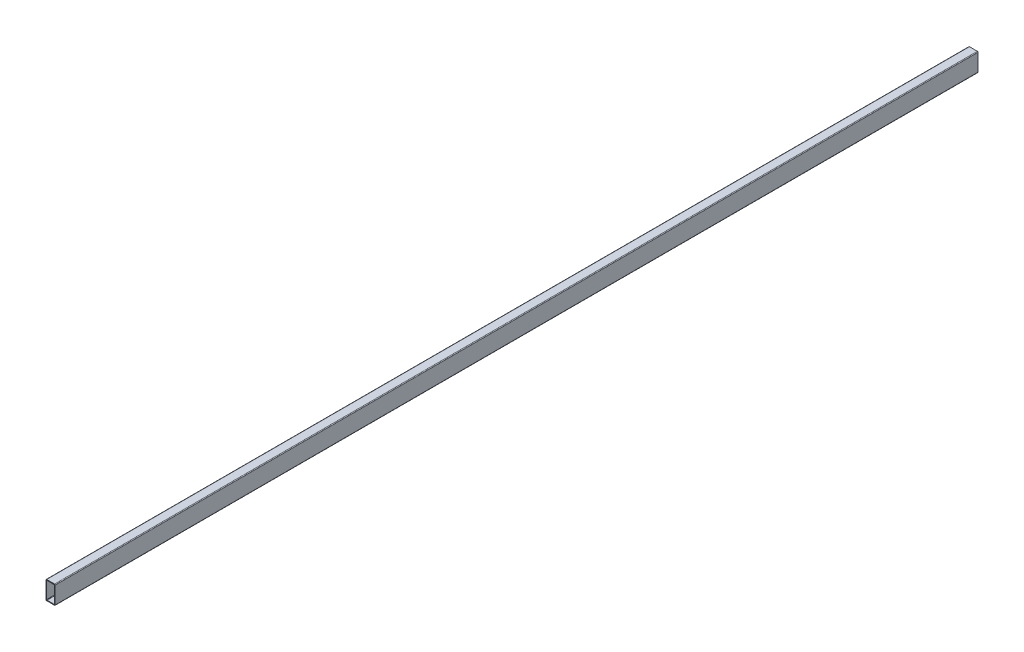
ISO-10303-21;
HEADER;
FILE_DESCRIPTION(('STEP AP214'),'2;1');
FILE_NAME('part.step','',(''),(''),'','','');
FILE_SCHEMA(('AUTOMOTIVE_DESIGN { 1 0 10303 214 1 1 1 1 }'));
ENDSEC;
DATA;
#1=APPLICATION_CONTEXT('core data for automotive mechanical design processes');
#2=APPLICATION_PROTOCOL_DEFINITION('international standard','automotive_design',2000,#1);
#3=PRODUCT_CONTEXT('',#1,'mechanical');
#4=PRODUCT('Part','Part','',(#3));
#5=PRODUCT_RELATED_PRODUCT_CATEGORY('part','',(#4));
#6=PRODUCT_DEFINITION_FORMATION('','',#4);
#7=PRODUCT_DEFINITION_CONTEXT('part definition',#1,'design');
#8=PRODUCT_DEFINITION('design','',#6,#7);
#9=PRODUCT_DEFINITION_SHAPE('','',#8);
#10=(LENGTH_UNIT() NAMED_UNIT(*) SI_UNIT(.MILLI.,.METRE.));
#11=(NAMED_UNIT(*) PLANE_ANGLE_UNIT() SI_UNIT($,.RADIAN.));
#12=(NAMED_UNIT(*) SI_UNIT($,.STERADIAN.) SOLID_ANGLE_UNIT());
#13=UNCERTAINTY_MEASURE_WITH_UNIT(LENGTH_MEASURE(1.E-05),#10,'distance_accuracy_value','');
#14=(GEOMETRIC_REPRESENTATION_CONTEXT(3) GLOBAL_UNCERTAINTY_ASSIGNED_CONTEXT((#13)) GLOBAL_UNIT_ASSIGNED_CONTEXT((#10,
#11,#12)) REPRESENTATION_CONTEXT('',''));
#15=CARTESIAN_POINT('',(0.,0.,0.));
#16=DIRECTION('',(0.,0.,1.));
#17=DIRECTION('',(1.,0.,0.));
#18=AXIS2_PLACEMENT_3D('',#15,#16,#17);
#19=CARTESIAN_POINT('',(18.5,38.4999999999994,1000.));
#20=DIRECTION('',(0.,0.,-1.));
#21=DIRECTION('',(-1.,0.,0.));
#22=AXIS2_PLACEMENT_3D('',#19,#20,#21);
#23=PLANE('',#22);
#24=CARTESIAN_POINT('',(18.5,38.4999999999994,1000.));
#25=DIRECTION('',(0.,0.,1.));
#26=DIRECTION('',(-1.,0.,0.));
#27=AXIS2_PLACEMENT_3D('',#24,#25,#26);
#28=CIRCLE('',#27,1.5);
#29=CARTESIAN_POINT('',(20.,38.4999999999994,1000.));
#30=VERTEX_POINT('',#29);
#31=CARTESIAN_POINT('',(18.5,39.9999999999994,1000.));
#32=VERTEX_POINT('',#31);
#33=EDGE_CURVE('E238',#30,#32,#28,.T.);
#34=ORIENTED_EDGE('',*,*,#33,.T.);
#35=DIRECTION('',(-1.,0.,0.));
#36=VECTOR('',#35,1.);
#37=CARTESIAN_POINT('',(1.5,39.9999999999994,1000.));
#38=LINE('',#37,#36);
#39=CARTESIAN_POINT('',(1.5,39.9999999999994,1000.));
#40=VERTEX_POINT('',#39);
#41=EDGE_CURVE('E240',#32,#40,#38,.T.);
#42=ORIENTED_EDGE('',*,*,#41,.T.);
#43=CARTESIAN_POINT('',(1.5,38.4999999999994,1000.));
#44=DIRECTION('',(0.,0.,1.));
#45=DIRECTION('',(-1.,0.,0.));
#46=AXIS2_PLACEMENT_3D('',#43,#44,#45);
#47=CIRCLE('',#46,1.50000000000001);
#48=CARTESIAN_POINT('',(0.,38.4999999999994,1000.));
#49=VERTEX_POINT('',#48);
#50=EDGE_CURVE('E242',#40,#49,#47,.T.);
#51=ORIENTED_EDGE('',*,*,#50,.T.);
#52=DIRECTION('',(0.,-1.,0.));
#53=VECTOR('',#52,1.);
#54=CARTESIAN_POINT('',(0.,38.4999999999994,1000.));
#55=LINE('',#54,#53);
#56=CARTESIAN_POINT('',(0.,1.4999999999994,1000.));
#57=VERTEX_POINT('',#56);
#58=EDGE_CURVE('E244',#49,#57,#55,.T.);
#59=ORIENTED_EDGE('',*,*,#58,.T.);
#60=CARTESIAN_POINT('',(1.5,1.4999999999994,1000.));
#61=DIRECTION('',(0.,0.,1.));
#62=DIRECTION('',(1.,0.,0.));
#63=AXIS2_PLACEMENT_3D('',#60,#61,#62);
#64=CIRCLE('',#63,1.50000000000001);
#65=CARTESIAN_POINT('',(1.5,-6.03683769639929E-13,1000.));
#66=VERTEX_POINT('',#65);
#67=EDGE_CURVE('E246',#57,#66,#64,.T.);
#68=ORIENTED_EDGE('',*,*,#67,.T.);
#69=DIRECTION('',(1.,0.,0.));
#70=VECTOR('',#69,1.);
#71=CARTESIAN_POINT('',(1.5,-6.10622663543836E-13,1000.));
#72=LINE('',#71,#70);
#73=CARTESIAN_POINT('',(18.5,-6.10622663543836E-13,1000.));
#74=VERTEX_POINT('',#73);
#75=EDGE_CURVE('E248',#66,#74,#72,.T.);
#76=ORIENTED_EDGE('',*,*,#75,.T.);
#77=CARTESIAN_POINT('',(18.5,1.4999999999994,1000.));
#78=DIRECTION('',(0.,0.,1.));
#79=DIRECTION('',(-1.,0.,0.));
#80=AXIS2_PLACEMENT_3D('',#77,#78,#79);
#81=CIRCLE('',#80,1.50000000000001);
#82=CARTESIAN_POINT('',(20.,1.4999999999994,1000.));
#83=VERTEX_POINT('',#82);
#84=EDGE_CURVE('E250',#74,#83,#81,.T.);
#85=ORIENTED_EDGE('',*,*,#84,.T.);
#86=DIRECTION('',(0.,1.,0.));
#87=VECTOR('',#86,1.);
#88=CARTESIAN_POINT('',(20.,38.4999999999994,1000.));
#89=LINE('',#88,#87);
#90=EDGE_CURVE('E58',#83,#30,#89,.T.);
#91=ORIENTED_EDGE('',*,*,#90,.T.);
#92=EDGE_LOOP('',(#34,#42,#51,#59,#68,#76,#85,#91));
#93=FACE_BOUND('',#92,.T.);
#94=CARTESIAN_POINT('',(17.5,2.49999999999941,1000.));
#95=DIRECTION('',(0.,0.,1.));
#96=DIRECTION('',(-1.,0.,0.));
#97=AXIS2_PLACEMENT_3D('',#94,#95,#96);
#98=CIRCLE('',#97,0.999999999999994);
#99=CARTESIAN_POINT('',(17.5,1.49999999999942,1000.));
#100=VERTEX_POINT('',#99);
#101=CARTESIAN_POINT('',(18.5,2.49999999999941,1000.));
#102=VERTEX_POINT('',#101);
#103=EDGE_CURVE('E211',#100,#102,#98,.T.);
#104=ORIENTED_EDGE('',*,*,#103,.F.);
#105=DIRECTION('',(1.,0.,0.));
#106=VECTOR('',#105,1.);
#107=CARTESIAN_POINT('',(2.50000000000001,1.4999999999994,1000.));
#108=LINE('',#107,#106);
#109=CARTESIAN_POINT('',(2.50000000000001,1.4999999999994,1000.));
#110=VERTEX_POINT('',#109);
#111=EDGE_CURVE('E153',#110,#100,#108,.T.);
#112=ORIENTED_EDGE('',*,*,#111,.F.);
#113=CARTESIAN_POINT('',(2.50000000000001,2.49999999999941,1000.));
#114=DIRECTION('',(0.,0.,1.));
#115=DIRECTION('',(1.,0.,0.));
#116=AXIS2_PLACEMENT_3D('',#113,#114,#115);
#117=CIRCLE('',#116,0.999999999999999);
#118=CARTESIAN_POINT('',(1.50000000000001,2.49999999999941,1000.));
#119=VERTEX_POINT('',#118);
#120=EDGE_CURVE('E223',#119,#110,#117,.T.);
#121=ORIENTED_EDGE('',*,*,#120,.F.);
#122=DIRECTION('',(0.,-1.,0.));
#123=VECTOR('',#122,1.);
#124=CARTESIAN_POINT('',(1.5,37.4999999999994,1000.));
#125=LINE('',#124,#123);
#126=CARTESIAN_POINT('',(1.50000000000001,37.4999999999994,1000.));
#127=VERTEX_POINT('',#126);
#128=EDGE_CURVE('E221',#127,#119,#125,.T.);
#129=ORIENTED_EDGE('',*,*,#128,.F.);
#130=CARTESIAN_POINT('',(2.50000000000001,37.4999999999994,1000.));
#131=DIRECTION('',(0.,0.,1.));
#132=DIRECTION('',(-1.,0.,0.));
#133=AXIS2_PLACEMENT_3D('',#130,#131,#132);
#134=CIRCLE('',#133,1.);
#135=CARTESIAN_POINT('',(2.50000000000001,38.4999999999994,1000.));
#136=VERTEX_POINT('',#135);
#137=EDGE_CURVE('E219',#136,#127,#134,.T.);
#138=ORIENTED_EDGE('',*,*,#137,.F.);
#139=DIRECTION('',(-1.,0.,0.));
#140=VECTOR('',#139,1.);
#141=CARTESIAN_POINT('',(2.50000000000001,38.4999999999994,1000.));
#142=LINE('',#141,#140);
#143=CARTESIAN_POINT('',(17.5,38.4999999999994,1000.));
#144=VERTEX_POINT('',#143);
#145=EDGE_CURVE('E217',#144,#136,#142,.T.);
#146=ORIENTED_EDGE('',*,*,#145,.F.);
#147=CARTESIAN_POINT('',(17.5,37.4999999999994,1000.));
#148=DIRECTION('',(0.,0.,1.));
#149=DIRECTION('',(-1.,0.,0.));
#150=AXIS2_PLACEMENT_3D('',#147,#148,#149);
#151=CIRCLE('',#150,1.);
#152=CARTESIAN_POINT('',(18.5,37.4999999999994,1000.));
#153=VERTEX_POINT('',#152);
#154=EDGE_CURVE('E215',#153,#144,#151,.T.);
#155=ORIENTED_EDGE('',*,*,#154,.F.);
#156=DIRECTION('',(0.,1.,0.));
#157=VECTOR('',#156,1.);
#158=CARTESIAN_POINT('',(18.5,37.4999999999994,1000.));
#159=LINE('',#158,#157);
#160=EDGE_CURVE('E213',#102,#153,#159,.T.);
#161=ORIENTED_EDGE('',*,*,#160,.F.);
#162=EDGE_LOOP('',(#104,#112,#121,#129,#138,#146,#155,#161));
#163=FACE_BOUND('',#162,.T.);
#164=ADVANCED_FACE('F35',(#93,#163),#23,.F.);
#165=CARTESIAN_POINT('',(18.5,38.4999999999994,1000.));
#166=DIRECTION('',(0.,0.,-1.));
#167=DIRECTION('',(-1.,0.,0.));
#168=AXIS2_PLACEMENT_3D('',#165,#166,#167);
#169=CYLINDRICAL_SURFACE('',#168,1.5);
#170=DIRECTION('',(0.,0.,-1.));
#171=VECTOR('',#170,1.);
#172=CARTESIAN_POINT('',(20.,38.4999999999994,1000.));
#173=LINE('',#172,#171);
#174=CARTESIAN_POINT('',(20.,38.4999999999994,-1000.));
#175=VERTEX_POINT('',#174);
#176=EDGE_CURVE('E253',#30,#175,#173,.T.);
#177=ORIENTED_EDGE('',*,*,#176,.T.);
#178=CARTESIAN_POINT('',(18.5,38.4999999999994,-1000.));
#179=DIRECTION('',(0.,0.,1.));
#180=DIRECTION('',(-1.,0.,0.));
#181=AXIS2_PLACEMENT_3D('',#178,#179,#180);
#182=CIRCLE('',#181,1.5);
#183=CARTESIAN_POINT('',(18.5,39.9999999999994,-1000.));
#184=VERTEX_POINT('',#183);
#185=EDGE_CURVE('E187',#175,#184,#182,.T.);
#186=ORIENTED_EDGE('',*,*,#185,.T.);
#187=DIRECTION('',(0.,0.,-1.));
#188=VECTOR('',#187,1.);
#189=CARTESIAN_POINT('',(18.5,39.9999999999994,1000.));
#190=LINE('',#189,#188);
#191=EDGE_CURVE('E11',#32,#184,#190,.T.);
#192=ORIENTED_EDGE('',*,*,#191,.F.);
#193=ORIENTED_EDGE('',*,*,#33,.F.);
#194=EDGE_LOOP('',(#177,#186,#192,#193));
#195=FACE_BOUND('',#194,.T.);
#196=ADVANCED_FACE('F37',(#195),#169,.T.);
#197=CARTESIAN_POINT('',(1.5,39.9999999999994,1000.));
#198=DIRECTION('',(0.,-1.,0.));
#199=DIRECTION('',(1.,0.,0.));
#200=AXIS2_PLACEMENT_3D('',#197,#198,#199);
#201=PLANE('',#200);
#202=ORIENTED_EDGE('',*,*,#191,.T.);
#203=DIRECTION('',(-1.,0.,0.));
#204=VECTOR('',#203,1.);
#205=CARTESIAN_POINT('',(1.5,39.9999999999994,-1000.));
#206=LINE('',#205,#204);
#207=CARTESIAN_POINT('',(1.5,39.9999999999994,-1000.));
#208=VERTEX_POINT('',#207);
#209=EDGE_CURVE('E208',#184,#208,#206,.T.);
#210=ORIENTED_EDGE('',*,*,#209,.T.);
#211=DIRECTION('',(0.,0.,-1.));
#212=VECTOR('',#211,1.);
#213=CARTESIAN_POINT('',(1.5,39.9999999999994,1000.));
#214=LINE('',#213,#212);
#215=EDGE_CURVE('E43',#40,#208,#214,.T.);
#216=ORIENTED_EDGE('',*,*,#215,.F.);
#217=ORIENTED_EDGE('',*,*,#41,.F.);
#218=EDGE_LOOP('',(#202,#210,#216,#217));
#219=FACE_BOUND('',#218,.T.);
#220=ADVANCED_FACE('F275',(#219),#201,.F.);
#221=CARTESIAN_POINT('',(1.5,38.4999999999994,1000.));
#222=DIRECTION('',(0.,0.,-1.));
#223=DIRECTION('',(-1.,0.,0.));
#224=AXIS2_PLACEMENT_3D('',#221,#222,#223);
#225=CYLINDRICAL_SURFACE('',#224,1.50000000000001);
#226=ORIENTED_EDGE('',*,*,#215,.T.);
#227=CARTESIAN_POINT('',(1.5,38.4999999999994,-1000.));
#228=DIRECTION('',(0.,0.,1.));
#229=DIRECTION('',(-1.,0.,0.));
#230=AXIS2_PLACEMENT_3D('',#227,#228,#229);
#231=CIRCLE('',#230,1.50000000000001);
#232=CARTESIAN_POINT('',(0.,38.4999999999994,-1000.));
#233=VERTEX_POINT('',#232);
#234=EDGE_CURVE('E205',#208,#233,#231,.T.);
#235=ORIENTED_EDGE('',*,*,#234,.T.);
#236=DIRECTION('',(0.,0.,-1.));
#237=VECTOR('',#236,1.);
#238=CARTESIAN_POINT('',(0.,38.4999999999994,1000.));
#239=LINE('',#238,#237);
#240=EDGE_CURVE('E263',#49,#233,#239,.T.);
#241=ORIENTED_EDGE('',*,*,#240,.F.);
#242=ORIENTED_EDGE('',*,*,#50,.F.);
#243=EDGE_LOOP('',(#226,#235,#241,#242));
#244=FACE_BOUND('',#243,.T.);
#245=ADVANCED_FACE('F268',(#244),#225,.T.);
#246=CARTESIAN_POINT('',(0.,38.4999999999994,1000.));
#247=DIRECTION('',(1.,0.,0.));
#248=DIRECTION('',(0.,1.,0.));
#249=AXIS2_PLACEMENT_3D('',#246,#247,#248);
#250=PLANE('',#249);
#251=ORIENTED_EDGE('',*,*,#240,.T.);
#252=DIRECTION('',(0.,-1.,0.));
#253=VECTOR('',#252,1.);
#254=CARTESIAN_POINT('',(0.,38.4999999999994,-1000.));
#255=LINE('',#254,#253);
#256=CARTESIAN_POINT('',(0.,1.4999999999994,-1000.));
#257=VERTEX_POINT('',#256);
#258=EDGE_CURVE('E202',#233,#257,#255,.T.);
#259=ORIENTED_EDGE('',*,*,#258,.T.);
#260=DIRECTION('',(0.,0.,-1.));
#261=VECTOR('',#260,1.);
#262=CARTESIAN_POINT('',(0.,1.4999999999994,1000.));
#263=LINE('',#262,#261);
#264=EDGE_CURVE('E261',#57,#257,#263,.T.);
#265=ORIENTED_EDGE('',*,*,#264,.F.);
#266=ORIENTED_EDGE('',*,*,#58,.F.);
#267=EDGE_LOOP('',(#251,#259,#265,#266));
#268=FACE_BOUND('',#267,.T.);
#269=ADVANCED_FACE('F298',(#268),#250,.F.);
#270=CARTESIAN_POINT('',(1.5,1.4999999999994,1000.));
#271=DIRECTION('',(0.,0.,-1.));
#272=DIRECTION('',(-1.,0.,0.));
#273=AXIS2_PLACEMENT_3D('',#270,#271,#272);
#274=CYLINDRICAL_SURFACE('',#273,1.50000000000001);
#275=ORIENTED_EDGE('',*,*,#264,.T.);
#276=CARTESIAN_POINT('',(1.5,1.4999999999994,-1000.));
#277=DIRECTION('',(0.,0.,1.));
#278=DIRECTION('',(1.,0.,0.));
#279=AXIS2_PLACEMENT_3D('',#276,#277,#278);
#280=CIRCLE('',#279,1.50000000000001);
#281=CARTESIAN_POINT('',(1.5,-6.03683769639929E-13,-1000.));
#282=VERTEX_POINT('',#281);
#283=EDGE_CURVE('E199',#257,#282,#280,.T.);
#284=ORIENTED_EDGE('',*,*,#283,.T.);
#285=DIRECTION('',(0.,0.,-1.));
#286=VECTOR('',#285,1.);
#287=CARTESIAN_POINT('',(1.5,-6.03683769639929E-13,1000.));
#288=LINE('',#287,#286);
#289=EDGE_CURVE('E259',#66,#282,#288,.T.);
#290=ORIENTED_EDGE('',*,*,#289,.F.);
#291=ORIENTED_EDGE('',*,*,#67,.F.);
#292=EDGE_LOOP('',(#275,#284,#290,#291));
#293=FACE_BOUND('',#292,.T.);
#294=ADVANCED_FACE('F295',(#293),#274,.T.);
#295=CARTESIAN_POINT('',(1.5,-6.10622663543836E-13,1000.));
#296=DIRECTION('',(0.,1.,0.));
#297=DIRECTION('',(0.,0.,1.));
#298=AXIS2_PLACEMENT_3D('',#295,#296,#297);
#299=PLANE('',#298);
#300=ORIENTED_EDGE('',*,*,#289,.T.);
#301=DIRECTION('',(1.,0.,0.));
#302=VECTOR('',#301,1.);
#303=CARTESIAN_POINT('',(1.5,-6.10622663543836E-13,-1000.));
#304=LINE('',#303,#302);
#305=CARTESIAN_POINT('',(18.5,-6.10622663543836E-13,-1000.));
#306=VERTEX_POINT('',#305);
#307=EDGE_CURVE('E196',#282,#306,#304,.T.);
#308=ORIENTED_EDGE('',*,*,#307,.T.);
#309=DIRECTION('',(0.,0.,-1.));
#310=VECTOR('',#309,1.);
#311=CARTESIAN_POINT('',(18.5,-6.10622663543836E-13,1000.));
#312=LINE('',#311,#310);
#313=EDGE_CURVE('E257',#74,#306,#312,.T.);
#314=ORIENTED_EDGE('',*,*,#313,.F.);
#315=ORIENTED_EDGE('',*,*,#75,.F.);
#316=EDGE_LOOP('',(#300,#308,#314,#315));
#317=FACE_BOUND('',#316,.T.);
#318=ADVANCED_FACE('F290',(#317),#299,.F.);
#319=CARTESIAN_POINT('',(18.5,1.4999999999994,1000.));
#320=DIRECTION('',(0.,0.,-1.));
#321=DIRECTION('',(-1.,0.,0.));
#322=AXIS2_PLACEMENT_3D('',#319,#320,#321);
#323=CYLINDRICAL_SURFACE('',#322,1.50000000000001);
#324=ORIENTED_EDGE('',*,*,#313,.T.);
#325=CARTESIAN_POINT('',(18.5,1.4999999999994,-1000.));
#326=DIRECTION('',(0.,0.,1.));
#327=DIRECTION('',(-1.,0.,0.));
#328=AXIS2_PLACEMENT_3D('',#325,#326,#327);
#329=CIRCLE('',#328,1.50000000000001);
#330=CARTESIAN_POINT('',(20.,1.4999999999994,-1000.));
#331=VERTEX_POINT('',#330);
#332=EDGE_CURVE('E193',#306,#331,#329,.T.);
#333=ORIENTED_EDGE('',*,*,#332,.T.);
#334=DIRECTION('',(0.,0.,-1.));
#335=VECTOR('',#334,1.);
#336=CARTESIAN_POINT('',(20.,1.4999999999994,1000.));
#337=LINE('',#336,#335);
#338=EDGE_CURVE('E255',#83,#331,#337,.T.);
#339=ORIENTED_EDGE('',*,*,#338,.F.);
#340=ORIENTED_EDGE('',*,*,#84,.F.);
#341=EDGE_LOOP('',(#324,#333,#339,#340));
#342=FACE_BOUND('',#341,.T.);
#343=ADVANCED_FACE('F286',(#342),#323,.T.);
#344=CARTESIAN_POINT('',(20.,38.4999999999994,1000.));
#345=DIRECTION('',(-1.,0.,0.));
#346=DIRECTION('',(0.,0.,1.));
#347=AXIS2_PLACEMENT_3D('',#344,#345,#346);
#348=PLANE('',#347);
#349=ORIENTED_EDGE('',*,*,#338,.T.);
#350=DIRECTION('',(0.,1.,0.));
#351=VECTOR('',#350,1.);
#352=CARTESIAN_POINT('',(20.,38.4999999999994,-1000.));
#353=LINE('',#352,#351);
#354=EDGE_CURVE('E190',#331,#175,#353,.T.);
#355=ORIENTED_EDGE('',*,*,#354,.T.);
#356=ORIENTED_EDGE('',*,*,#176,.F.);
#357=ORIENTED_EDGE('',*,*,#90,.F.);
#358=EDGE_LOOP('',(#349,#355,#356,#357));
#359=FACE_BOUND('',#358,.T.);
#360=ADVANCED_FACE('F282',(#359),#348,.F.);
#361=CARTESIAN_POINT('',(17.5,2.49999999999941,1000.));
#362=DIRECTION('',(0.,0.,-1.));
#363=DIRECTION('',(-1.,0.,0.));
#364=AXIS2_PLACEMENT_3D('',#361,#362,#363);
#365=CYLINDRICAL_SURFACE('',#364,0.999999999999994);
#366=DIRECTION('',(0.,0.,-1.));
#367=VECTOR('',#366,1.);
#368=CARTESIAN_POINT('',(18.5,2.49999999999941,1000.));
#369=LINE('',#368,#367);
#370=CARTESIAN_POINT('',(18.5,2.49999999999941,-1000.));
#371=VERTEX_POINT('',#370);
#372=EDGE_CURVE('E161',#102,#371,#369,.T.);
#373=ORIENTED_EDGE('',*,*,#372,.T.);
#374=CARTESIAN_POINT('',(17.5,2.49999999999941,-1000.));
#375=DIRECTION('',(0.,0.,1.));
#376=DIRECTION('',(-1.,0.,0.));
#377=AXIS2_PLACEMENT_3D('',#374,#375,#376);
#378=CIRCLE('',#377,0.999999999999994);
#379=CARTESIAN_POINT('',(17.5,1.49999999999942,-1000.));
#380=VERTEX_POINT('',#379);
#381=EDGE_CURVE('E158',#380,#371,#378,.T.);
#382=ORIENTED_EDGE('',*,*,#381,.F.);
#383=DIRECTION('',(0.,0.,-1.));
#384=VECTOR('',#383,1.);
#385=CARTESIAN_POINT('',(17.5,1.49999999999942,1000.));
#386=LINE('',#385,#384);
#387=EDGE_CURVE('E146',#100,#380,#386,.T.);
#388=ORIENTED_EDGE('',*,*,#387,.F.);
#389=ORIENTED_EDGE('',*,*,#103,.T.);
#390=EDGE_LOOP('',(#373,#382,#388,#389));
#391=FACE_BOUND('',#390,.T.);
#392=ADVANCED_FACE('F159',(#391),#365,.F.);
#393=CARTESIAN_POINT('',(18.5,37.4999999999994,1000.));
#394=DIRECTION('',(-1.,0.,0.));
#395=DIRECTION('',(0.,0.,1.));
#396=AXIS2_PLACEMENT_3D('',#393,#394,#395);
#397=PLANE('',#396);
#398=DIRECTION('',(0.,0.,-1.));
#399=VECTOR('',#398,1.);
#400=CARTESIAN_POINT('',(18.5,37.4999999999994,1000.));
#401=LINE('',#400,#399);
#402=CARTESIAN_POINT('',(18.5,37.4999999999994,-1000.));
#403=VERTEX_POINT('',#402);
#404=EDGE_CURVE('E235',#153,#403,#401,.T.);
#405=ORIENTED_EDGE('',*,*,#404,.T.);
#406=DIRECTION('',(0.,1.,0.));
#407=VECTOR('',#406,1.);
#408=CARTESIAN_POINT('',(18.5,37.4999999999994,-1000.));
#409=LINE('',#408,#407);
#410=EDGE_CURVE('E185',#371,#403,#409,.T.);
#411=ORIENTED_EDGE('',*,*,#410,.F.);
#412=ORIENTED_EDGE('',*,*,#372,.F.);
#413=ORIENTED_EDGE('',*,*,#160,.T.);
#414=EDGE_LOOP('',(#405,#411,#412,#413));
#415=FACE_BOUND('',#414,.T.);
#416=ADVANCED_FACE('F307',(#415),#397,.T.);
#417=CARTESIAN_POINT('',(17.5,37.4999999999994,1000.));
#418=DIRECTION('',(0.,0.,-1.));
#419=DIRECTION('',(-1.,0.,0.));
#420=AXIS2_PLACEMENT_3D('',#417,#418,#419);
#421=CYLINDRICAL_SURFACE('',#420,1.);
#422=DIRECTION('',(0.,0.,-1.));
#423=VECTOR('',#422,1.);
#424=CARTESIAN_POINT('',(17.5,38.4999999999994,1000.));
#425=LINE('',#424,#423);
#426=CARTESIAN_POINT('',(17.5,38.4999999999994,-1000.));
#427=VERTEX_POINT('',#426);
#428=EDGE_CURVE('E233',#144,#427,#425,.T.);
#429=ORIENTED_EDGE('',*,*,#428,.T.);
#430=CARTESIAN_POINT('',(17.5,37.4999999999994,-1000.));
#431=DIRECTION('',(0.,0.,1.));
#432=DIRECTION('',(-1.,0.,0.));
#433=AXIS2_PLACEMENT_3D('',#430,#431,#432);
#434=CIRCLE('',#433,1.);
#435=EDGE_CURVE('E182',#403,#427,#434,.T.);
#436=ORIENTED_EDGE('',*,*,#435,.F.);
#437=ORIENTED_EDGE('',*,*,#404,.F.);
#438=ORIENTED_EDGE('',*,*,#154,.T.);
#439=EDGE_LOOP('',(#429,#436,#437,#438));
#440=FACE_BOUND('',#439,.T.);
#441=ADVANCED_FACE('F312',(#440),#421,.F.);
#442=CARTESIAN_POINT('',(2.50000000000001,38.4999999999994,1000.));
#443=DIRECTION('',(0.,-1.,0.));
#444=DIRECTION('',(0.,0.,-1.));
#445=AXIS2_PLACEMENT_3D('',#442,#443,#444);
#446=PLANE('',#445);
#447=DIRECTION('',(0.,0.,-1.));
#448=VECTOR('',#447,1.);
#449=CARTESIAN_POINT('',(2.50000000000001,38.4999999999994,1000.));
#450=LINE('',#449,#448);
#451=CARTESIAN_POINT('',(2.50000000000001,38.4999999999994,-1000.));
#452=VERTEX_POINT('',#451);
#453=EDGE_CURVE('E231',#136,#452,#450,.T.);
#454=ORIENTED_EDGE('',*,*,#453,.T.);
#455=DIRECTION('',(-1.,0.,0.));
#456=VECTOR('',#455,1.);
#457=CARTESIAN_POINT('',(2.50000000000001,38.4999999999994,-1000.));
#458=LINE('',#457,#456);
#459=EDGE_CURVE('E179',#427,#452,#458,.T.);
#460=ORIENTED_EDGE('',*,*,#459,.F.);
#461=ORIENTED_EDGE('',*,*,#428,.F.);
#462=ORIENTED_EDGE('',*,*,#145,.T.);
#463=EDGE_LOOP('',(#454,#460,#461,#462));
#464=FACE_BOUND('',#463,.T.);
#465=ADVANCED_FACE('F316',(#464),#446,.T.);
#466=CARTESIAN_POINT('',(2.50000000000001,37.4999999999994,1000.));
#467=DIRECTION('',(0.,0.,-1.));
#468=DIRECTION('',(-1.,0.,0.));
#469=AXIS2_PLACEMENT_3D('',#466,#467,#468);
#470=CYLINDRICAL_SURFACE('',#469,1.);
#471=DIRECTION('',(0.,0.,-1.));
#472=VECTOR('',#471,1.);
#473=CARTESIAN_POINT('',(1.50000000000001,37.4999999999994,1000.));
#474=LINE('',#473,#472);
#475=CARTESIAN_POINT('',(1.50000000000001,37.4999999999994,-1000.));
#476=VERTEX_POINT('',#475);
#477=EDGE_CURVE('E229',#127,#476,#474,.T.);
#478=ORIENTED_EDGE('',*,*,#477,.T.);
#479=CARTESIAN_POINT('',(2.50000000000001,37.4999999999994,-1000.));
#480=DIRECTION('',(0.,0.,1.));
#481=DIRECTION('',(-1.,0.,0.));
#482=AXIS2_PLACEMENT_3D('',#479,#480,#481);
#483=CIRCLE('',#482,1.);
#484=EDGE_CURVE('E176',#452,#476,#483,.T.);
#485=ORIENTED_EDGE('',*,*,#484,.F.);
#486=ORIENTED_EDGE('',*,*,#453,.F.);
#487=ORIENTED_EDGE('',*,*,#137,.T.);
#488=EDGE_LOOP('',(#478,#485,#486,#487));
#489=FACE_BOUND('',#488,.T.);
#490=ADVANCED_FACE('F321',(#489),#470,.F.);
#491=CARTESIAN_POINT('',(1.5,37.4999999999994,1000.));
#492=DIRECTION('',(1.,0.,0.));
#493=DIRECTION('',(0.,1.,0.));
#494=AXIS2_PLACEMENT_3D('',#491,#492,#493);
#495=PLANE('',#494);
#496=DIRECTION('',(0.,0.,-1.));
#497=VECTOR('',#496,1.);
#498=CARTESIAN_POINT('',(1.50000000000001,2.49999999999941,1000.));
#499=LINE('',#498,#497);
#500=CARTESIAN_POINT('',(1.50000000000001,2.49999999999941,-1000.));
#501=VERTEX_POINT('',#500);
#502=EDGE_CURVE('E227',#119,#501,#499,.T.);
#503=ORIENTED_EDGE('',*,*,#502,.T.);
#504=DIRECTION('',(0.,-1.,0.));
#505=VECTOR('',#504,1.);
#506=CARTESIAN_POINT('',(1.5,37.4999999999994,-1000.));
#507=LINE('',#506,#505);
#508=EDGE_CURVE('E172',#476,#501,#507,.T.);
#509=ORIENTED_EDGE('',*,*,#508,.F.);
#510=ORIENTED_EDGE('',*,*,#477,.F.);
#511=ORIENTED_EDGE('',*,*,#128,.T.);
#512=EDGE_LOOP('',(#503,#509,#510,#511));
#513=FACE_BOUND('',#512,.T.);
#514=ADVANCED_FACE('F325',(#513),#495,.T.);
#515=CARTESIAN_POINT('',(2.50000000000001,2.49999999999941,1000.));
#516=DIRECTION('',(0.,0.,-1.));
#517=DIRECTION('',(-1.,0.,0.));
#518=AXIS2_PLACEMENT_3D('',#515,#516,#517);
#519=CYLINDRICAL_SURFACE('',#518,0.999999999999999);
#520=DIRECTION('',(0.,0.,-1.));
#521=VECTOR('',#520,1.);
#522=CARTESIAN_POINT('',(2.50000000000001,1.49999999999941,1000.));
#523=LINE('',#522,#521);
#524=CARTESIAN_POINT('',(2.50000000000001,1.49999999999941,-1000.));
#525=VERTEX_POINT('',#524);
#526=EDGE_CURVE('E50',#110,#525,#523,.T.);
#527=ORIENTED_EDGE('',*,*,#526,.T.);
#528=CARTESIAN_POINT('',(2.50000000000001,2.49999999999941,-1000.));
#529=DIRECTION('',(0.,0.,1.));
#530=DIRECTION('',(1.,0.,0.));
#531=AXIS2_PLACEMENT_3D('',#528,#529,#530);
#532=CIRCLE('',#531,0.999999999999999);
#533=EDGE_CURVE('E170',#501,#525,#532,.T.);
#534=ORIENTED_EDGE('',*,*,#533,.F.);
#535=ORIENTED_EDGE('',*,*,#502,.F.);
#536=ORIENTED_EDGE('',*,*,#120,.T.);
#537=EDGE_LOOP('',(#527,#534,#535,#536));
#538=FACE_BOUND('',#537,.T.);
#539=ADVANCED_FACE('F329',(#538),#519,.F.);
#540=CARTESIAN_POINT('',(2.50000000000001,1.4999999999994,1000.));
#541=DIRECTION('',(0.,1.,0.));
#542=DIRECTION('',(-1.,0.,0.));
#543=AXIS2_PLACEMENT_3D('',#540,#541,#542);
#544=PLANE('',#543);
#545=ORIENTED_EDGE('',*,*,#387,.T.);
#546=DIRECTION('',(1.,0.,0.));
#547=VECTOR('',#546,1.);
#548=CARTESIAN_POINT('',(2.50000000000001,1.4999999999994,-1000.));
#549=LINE('',#548,#547);
#550=EDGE_CURVE('E150',#525,#380,#549,.T.);
#551=ORIENTED_EDGE('',*,*,#550,.F.);
#552=ORIENTED_EDGE('',*,*,#526,.F.);
#553=ORIENTED_EDGE('',*,*,#111,.T.);
#554=EDGE_LOOP('',(#545,#551,#552,#553));
#555=FACE_BOUND('',#554,.T.);
#556=ADVANCED_FACE('F148',(#555),#544,.T.);
#557=CARTESIAN_POINT('',(18.5,38.4999999999994,-1000.));
#558=DIRECTION('',(0.,0.,1.));
#559=DIRECTION('',(-1.,0.,0.));
#560=AXIS2_PLACEMENT_3D('',#557,#558,#559);
#561=PLANE('',#560);
#562=ORIENTED_EDGE('',*,*,#550,.T.);
#563=ORIENTED_EDGE('',*,*,#381,.T.);
#564=ORIENTED_EDGE('',*,*,#410,.T.);
#565=ORIENTED_EDGE('',*,*,#435,.T.);
#566=ORIENTED_EDGE('',*,*,#459,.T.);
#567=ORIENTED_EDGE('',*,*,#484,.T.);
#568=ORIENTED_EDGE('',*,*,#508,.T.);
#569=ORIENTED_EDGE('',*,*,#533,.T.);
#570=EDGE_LOOP('',(#562,#563,#564,#565,#566,#567,#568,#569));
#571=FACE_BOUND('',#570,.T.);
#572=ORIENTED_EDGE('',*,*,#185,.F.);
#573=ORIENTED_EDGE('',*,*,#354,.F.);
#574=ORIENTED_EDGE('',*,*,#332,.F.);
#575=ORIENTED_EDGE('',*,*,#307,.F.);
#576=ORIENTED_EDGE('',*,*,#283,.F.);
#577=ORIENTED_EDGE('',*,*,#258,.F.);
#578=ORIENTED_EDGE('',*,*,#234,.F.);
#579=ORIENTED_EDGE('',*,*,#209,.F.);
#580=EDGE_LOOP('',(#572,#573,#574,#575,#576,#577,#578,#579));
#581=FACE_BOUND('',#580,.T.);
#582=ADVANCED_FACE('F166',(#571,#581),#561,.F.);
#583=CLOSED_SHELL('',(#164,#196,#220,#245,#269,#294,#318,#343,#360,#392,#416,#441,#465,#490,
#514,#539,#556,#582));
#584=MANIFOLD_SOLID_BREP('B2',#583);
#585=ADVANCED_BREP_SHAPE_REPRESENTATION('',(#18,#584),#14);
#586=SHAPE_DEFINITION_REPRESENTATION(#9,#585);
ENDSEC;
END-ISO-10303-21;
